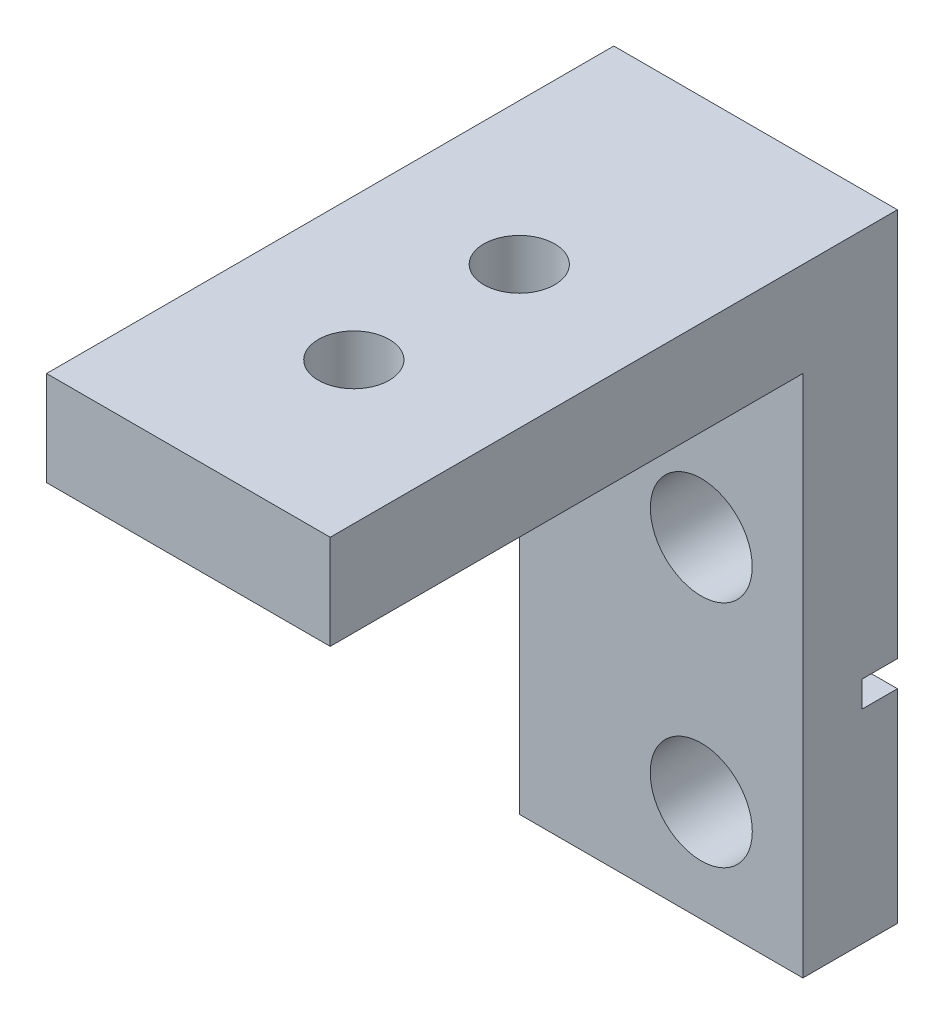
ISO-10303-21;
HEADER;
FILE_DESCRIPTION(('STEP AP214'),'2;1');
FILE_NAME('part.step','',(''),(''),'','','');
FILE_SCHEMA(('AUTOMOTIVE_DESIGN { 1 0 10303 214 1 1 1 1 }'));
ENDSEC;
DATA;
#1=APPLICATION_CONTEXT('core data for automotive mechanical design processes');
#2=APPLICATION_PROTOCOL_DEFINITION('international standard','automotive_design',2000,#1);
#3=PRODUCT_CONTEXT('',#1,'mechanical');
#4=PRODUCT('Part','Part','',(#3));
#5=PRODUCT_RELATED_PRODUCT_CATEGORY('part','',(#4));
#6=PRODUCT_DEFINITION_FORMATION('','',#4);
#7=PRODUCT_DEFINITION_CONTEXT('part definition',#1,'design');
#8=PRODUCT_DEFINITION('design','',#6,#7);
#9=PRODUCT_DEFINITION_SHAPE('','',#8);
#10=(LENGTH_UNIT() NAMED_UNIT(*) SI_UNIT(.MILLI.,.METRE.));
#11=(NAMED_UNIT(*) PLANE_ANGLE_UNIT() SI_UNIT($,.RADIAN.));
#12=(NAMED_UNIT(*) SI_UNIT($,.STERADIAN.) SOLID_ANGLE_UNIT());
#13=UNCERTAINTY_MEASURE_WITH_UNIT(LENGTH_MEASURE(1.E-05),#10,'distance_accuracy_value','');
#14=(GEOMETRIC_REPRESENTATION_CONTEXT(3) GLOBAL_UNCERTAINTY_ASSIGNED_CONTEXT((#13)) GLOBAL_UNIT_ASSIGNED_CONTEXT((#10,
#11,#12)) REPRESENTATION_CONTEXT('',''));
#15=CARTESIAN_POINT('',(0.,0.,0.));
#16=DIRECTION('',(0.,0.,1.));
#17=DIRECTION('',(1.,0.,0.));
#18=AXIS2_PLACEMENT_3D('',#15,#16,#17);
#19=CARTESIAN_POINT('',(-6.,-11.1,4.));
#20=DIRECTION('',(1.,0.,0.));
#21=DIRECTION('',(0.,0.,-1.));
#22=AXIS2_PLACEMENT_3D('',#19,#20,#21);
#23=PLANE('',#22);
#24=DIRECTION('',(0.,-1.,0.));
#25=VECTOR('',#24,1.);
#26=CARTESIAN_POINT('',(-6.,-11.1,4.));
#27=LINE('',#26,#25);
#28=CARTESIAN_POINT('',(-6.,11.05,4.));
#29=VERTEX_POINT('',#28);
#30=CARTESIAN_POINT('',(-6.,-11.1,4.));
#31=VERTEX_POINT('',#30);
#32=EDGE_CURVE('E144',#29,#31,#27,.T.);
#33=ORIENTED_EDGE('',*,*,#32,.F.);
#34=DIRECTION('',(0.,0.,-1.));
#35=VECTOR('',#34,1.);
#36=CARTESIAN_POINT('',(-6.,11.05,24.));
#37=LINE('',#36,#35);
#38=CARTESIAN_POINT('',(-6.,11.05,24.));
#39=VERTEX_POINT('',#38);
#40=EDGE_CURVE('E124',#39,#29,#37,.T.);
#41=ORIENTED_EDGE('',*,*,#40,.F.);
#42=DIRECTION('',(0.,-1.,0.));
#43=VECTOR('',#42,1.);
#44=CARTESIAN_POINT('',(-6.,15.05,24.));
#45=LINE('',#44,#43);
#46=CARTESIAN_POINT('',(-6.,15.05,24.));
#47=VERTEX_POINT('',#46);
#48=EDGE_CURVE('E132',#47,#39,#45,.T.);
#49=ORIENTED_EDGE('',*,*,#48,.F.);
#50=DIRECTION('',(0.,0.,1.));
#51=VECTOR('',#50,1.);
#52=CARTESIAN_POINT('',(-6.,15.05,0.));
#53=LINE('',#52,#51);
#54=CARTESIAN_POINT('',(-6.,15.05,0.));
#55=VERTEX_POINT('',#54);
#56=EDGE_CURVE('E156',#55,#47,#53,.T.);
#57=ORIENTED_EDGE('',*,*,#56,.F.);
#58=DIRECTION('',(0.,-1.,0.));
#59=VECTOR('',#58,1.);
#60=CARTESIAN_POINT('',(-6.,-11.1,0.));
#61=LINE('',#60,#59);
#62=CARTESIAN_POINT('',(-6.,-1.4,0.));
#63=VERTEX_POINT('',#62);
#64=EDGE_CURVE('E223',#55,#63,#61,.T.);
#65=ORIENTED_EDGE('',*,*,#64,.T.);
#66=DIRECTION('',(0.,0.,-1.));
#67=VECTOR('',#66,1.);
#68=CARTESIAN_POINT('',(-6.,-1.4,1.5));
#69=LINE('',#68,#67);
#70=CARTESIAN_POINT('',(-6.,-1.4,1.5));
#71=VERTEX_POINT('',#70);
#72=EDGE_CURVE('E184',#71,#63,#69,.T.);
#73=ORIENTED_EDGE('',*,*,#72,.F.);
#74=DIRECTION('',(0.,1.,0.));
#75=VECTOR('',#74,1.);
#76=CARTESIAN_POINT('',(-6.,0.,1.5));
#77=LINE('',#76,#75);
#78=CARTESIAN_POINT('',(-6.,-2.5,1.5));
#79=VERTEX_POINT('',#78);
#80=EDGE_CURVE('E174',#79,#71,#77,.T.);
#81=ORIENTED_EDGE('',*,*,#80,.F.);
#82=DIRECTION('',(0.,0.,-1.));
#83=VECTOR('',#82,1.);
#84=CARTESIAN_POINT('',(-6.,-2.5,1.5));
#85=LINE('',#84,#83);
#86=CARTESIAN_POINT('',(-6.,-2.5,0.));
#87=VERTEX_POINT('',#86);
#88=EDGE_CURVE('E189',#79,#87,#85,.T.);
#89=ORIENTED_EDGE('',*,*,#88,.T.);
#90=CARTESIAN_POINT('',(-6.,-11.1,0.));
#91=VERTEX_POINT('',#90);
#92=EDGE_CURVE('E202',#87,#91,#61,.T.);
#93=ORIENTED_EDGE('',*,*,#92,.T.);
#94=DIRECTION('',(0.,0.,-1.));
#95=VECTOR('',#94,1.);
#96=CARTESIAN_POINT('',(-6.,-11.1,4.));
#97=LINE('',#96,#95);
#98=EDGE_CURVE('E11',#31,#91,#97,.T.);
#99=ORIENTED_EDGE('',*,*,#98,.F.);
#100=EDGE_LOOP('',(#33,#41,#49,#57,#65,#73,#81,#89,#93,#99));
#101=FACE_BOUND('',#100,.T.);
#102=ADVANCED_FACE('F43',(#101),#23,.F.);
#103=CARTESIAN_POINT('',(6.,-11.1,4.));
#104=DIRECTION('',(-1.,0.,0.));
#105=DIRECTION('',(0.,0.,1.));
#106=AXIS2_PLACEMENT_3D('',#103,#104,#105);
#107=PLANE('',#106);
#108=DIRECTION('',(0.,1.,0.));
#109=VECTOR('',#108,1.);
#110=CARTESIAN_POINT('',(6.,-11.1,0.));
#111=LINE('',#110,#109);
#112=CARTESIAN_POINT('',(6.,-1.4,0.));
#113=VERTEX_POINT('',#112);
#114=CARTESIAN_POINT('',(6.,15.05,0.));
#115=VERTEX_POINT('',#114);
#116=EDGE_CURVE('E229',#113,#115,#111,.T.);
#117=ORIENTED_EDGE('',*,*,#116,.T.);
#118=DIRECTION('',(0.,0.,1.));
#119=VECTOR('',#118,1.);
#120=CARTESIAN_POINT('',(6.,15.05,0.));
#121=LINE('',#120,#119);
#122=CARTESIAN_POINT('',(6.,15.05,24.));
#123=VERTEX_POINT('',#122);
#124=EDGE_CURVE('E151',#115,#123,#121,.T.);
#125=ORIENTED_EDGE('',*,*,#124,.T.);
#126=DIRECTION('',(0.,1.,0.));
#127=VECTOR('',#126,1.);
#128=CARTESIAN_POINT('',(6.,15.05,24.));
#129=LINE('',#128,#127);
#130=CARTESIAN_POINT('',(6.,11.05,24.));
#131=VERTEX_POINT('',#130);
#132=EDGE_CURVE('E131',#131,#123,#129,.T.);
#133=ORIENTED_EDGE('',*,*,#132,.F.);
#134=DIRECTION('',(0.,0.,-1.));
#135=VECTOR('',#134,1.);
#136=CARTESIAN_POINT('',(6.,11.05,24.));
#137=LINE('',#136,#135);
#138=CARTESIAN_POINT('',(6.,11.05,4.));
#139=VERTEX_POINT('',#138);
#140=EDGE_CURVE('E126',#131,#139,#137,.T.);
#141=ORIENTED_EDGE('',*,*,#140,.T.);
#142=DIRECTION('',(0.,1.,0.));
#143=VECTOR('',#142,1.);
#144=CARTESIAN_POINT('',(6.,-11.1,4.));
#145=LINE('',#144,#143);
#146=CARTESIAN_POINT('',(6.,-11.1,4.));
#147=VERTEX_POINT('',#146);
#148=EDGE_CURVE('E220',#147,#139,#145,.T.);
#149=ORIENTED_EDGE('',*,*,#148,.F.);
#150=DIRECTION('',(0.,0.,-1.));
#151=VECTOR('',#150,1.);
#152=CARTESIAN_POINT('',(6.,-11.1,4.));
#153=LINE('',#152,#151);
#154=CARTESIAN_POINT('',(6.,-11.1,0.));
#155=VERTEX_POINT('',#154);
#156=EDGE_CURVE('E51',#147,#155,#153,.T.);
#157=ORIENTED_EDGE('',*,*,#156,.T.);
#158=CARTESIAN_POINT('',(6.,-2.5,0.));
#159=VERTEX_POINT('',#158);
#160=EDGE_CURVE('E217',#155,#159,#111,.T.);
#161=ORIENTED_EDGE('',*,*,#160,.T.);
#162=DIRECTION('',(0.,0.,-1.));
#163=VECTOR('',#162,1.);
#164=CARTESIAN_POINT('',(6.,-2.5,1.5));
#165=LINE('',#164,#163);
#166=CARTESIAN_POINT('',(6.,-2.5,1.5));
#167=VERTEX_POINT('',#166);
#168=EDGE_CURVE('E66',#167,#159,#165,.T.);
#169=ORIENTED_EDGE('',*,*,#168,.F.);
#170=DIRECTION('',(0.,-1.,0.));
#171=VECTOR('',#170,1.);
#172=CARTESIAN_POINT('',(6.,0.,1.5));
#173=LINE('',#172,#171);
#174=CARTESIAN_POINT('',(6.,-1.4,1.5));
#175=VERTEX_POINT('',#174);
#176=EDGE_CURVE('E165',#175,#167,#173,.T.);
#177=ORIENTED_EDGE('',*,*,#176,.F.);
#178=DIRECTION('',(0.,0.,-1.));
#179=VECTOR('',#178,1.);
#180=CARTESIAN_POINT('',(6.,-1.4,1.5));
#181=LINE('',#180,#179);
#182=EDGE_CURVE('E178',#175,#113,#181,.T.);
#183=ORIENTED_EDGE('',*,*,#182,.T.);
#184=EDGE_LOOP('',(#117,#125,#133,#141,#149,#157,#161,#169,#177,#183));
#185=FACE_BOUND('',#184,.T.);
#186=ADVANCED_FACE('F238',(#185),#107,.F.);
#187=CARTESIAN_POINT('',(0.,0.,0.));
#188=DIRECTION('',(0.,0.,1.));
#189=DIRECTION('',(1.,0.,0.));
#190=AXIS2_PLACEMENT_3D('',#187,#188,#189);
#191=PLANE('',#190);
#192=CARTESIAN_POINT('',(1.7,2.9,0.));
#193=DIRECTION('',(0.,0.,1.));
#194=DIRECTION('',(1.,0.,0.));
#195=AXIS2_PLACEMENT_3D('',#192,#193,#194);
#196=CIRCLE('',#195,2.155);
#197=CARTESIAN_POINT('',(3.855,2.9,0.));
#198=VERTEX_POINT('',#197);
#199=EDGE_CURVE('E188',#198,#198,#196,.T.);
#200=ORIENTED_EDGE('',*,*,#199,.T.);
#201=EDGE_LOOP('',(#200));
#202=FACE_BOUND('',#201,.T.);
#203=ORIENTED_EDGE('',*,*,#64,.F.);
#204=DIRECTION('',(-1.,0.,0.));
#205=VECTOR('',#204,1.);
#206=CARTESIAN_POINT('',(6.,15.05,0.));
#207=LINE('',#206,#205);
#208=EDGE_CURVE('E146',#115,#55,#207,.T.);
#209=ORIENTED_EDGE('',*,*,#208,.F.);
#210=ORIENTED_EDGE('',*,*,#116,.F.);
#211=DIRECTION('',(-1.,0.,0.));
#212=VECTOR('',#211,1.);
#213=CARTESIAN_POINT('',(0.,-1.4,0.));
#214=LINE('',#213,#212);
#215=EDGE_CURVE('E159',#113,#63,#214,.T.);
#216=ORIENTED_EDGE('',*,*,#215,.T.);
#217=EDGE_LOOP('',(#203,#209,#210,#216));
#218=FACE_BOUND('',#217,.T.);
#219=ADVANCED_FACE('F257',(#202,#218),#191,.F.);
#220=CARTESIAN_POINT('',(6.,-11.1,4.));
#221=DIRECTION('',(0.,1.,0.));
#222=DIRECTION('',(-1.,0.,0.));
#223=AXIS2_PLACEMENT_3D('',#220,#221,#222);
#224=PLANE('',#223);
#225=DIRECTION('',(1.,0.,0.));
#226=VECTOR('',#225,1.);
#227=CARTESIAN_POINT('',(6.,-11.1,0.));
#228=LINE('',#227,#226);
#229=EDGE_CURVE('E226',#91,#155,#228,.T.);
#230=ORIENTED_EDGE('',*,*,#229,.T.);
#231=ORIENTED_EDGE('',*,*,#156,.F.);
#232=DIRECTION('',(1.,0.,0.));
#233=VECTOR('',#232,1.);
#234=CARTESIAN_POINT('',(6.,-11.1,4.));
#235=LINE('',#234,#233);
#236=EDGE_CURVE('E216',#31,#147,#235,.T.);
#237=ORIENTED_EDGE('',*,*,#236,.F.);
#238=ORIENTED_EDGE('',*,*,#98,.T.);
#239=EDGE_LOOP('',(#230,#231,#237,#238));
#240=FACE_BOUND('',#239,.T.);
#241=ADVANCED_FACE('F313',(#240),#224,.F.);
#242=CARTESIAN_POINT('',(0.,0.,4.));
#243=DIRECTION('',(0.,0.,1.));
#244=DIRECTION('',(1.,0.,0.));
#245=AXIS2_PLACEMENT_3D('',#242,#243,#244);
#246=PLANE('',#245);
#247=DIRECTION('',(1.,0.,0.));
#248=VECTOR('',#247,1.);
#249=CARTESIAN_POINT('',(-6.,11.05,4.));
#250=LINE('',#249,#248);
#251=EDGE_CURVE('E58',#29,#139,#250,.T.);
#252=ORIENTED_EDGE('',*,*,#251,.F.);
#253=ORIENTED_EDGE('',*,*,#32,.T.);
#254=ORIENTED_EDGE('',*,*,#236,.T.);
#255=ORIENTED_EDGE('',*,*,#148,.T.);
#256=EDGE_LOOP('',(#252,#253,#254,#255));
#257=FACE_BOUND('',#256,.T.);
#258=CARTESIAN_POINT('',(1.7,-6.8,4.));
#259=DIRECTION('',(0.,0.,1.));
#260=DIRECTION('',(1.,0.,0.));
#261=AXIS2_PLACEMENT_3D('',#258,#259,#260);
#262=CIRCLE('',#261,2.16);
#263=CARTESIAN_POINT('',(3.86,-6.8,4.));
#264=VERTEX_POINT('',#263);
#265=EDGE_CURVE('E203',#264,#264,#262,.T.);
#266=ORIENTED_EDGE('',*,*,#265,.F.);
#267=EDGE_LOOP('',(#266));
#268=FACE_BOUND('',#267,.T.);
#269=CARTESIAN_POINT('',(1.7,2.9,4.));
#270=DIRECTION('',(0.,0.,1.));
#271=DIRECTION('',(1.,0.,0.));
#272=AXIS2_PLACEMENT_3D('',#269,#270,#271);
#273=CIRCLE('',#272,2.155);
#274=CARTESIAN_POINT('',(3.855,2.9,4.));
#275=VERTEX_POINT('',#274);
#276=EDGE_CURVE('E207',#275,#275,#273,.T.);
#277=ORIENTED_EDGE('',*,*,#276,.F.);
#278=EDGE_LOOP('',(#277));
#279=FACE_BOUND('',#278,.T.);
#280=ADVANCED_FACE('F318',(#257,#268,#279),#246,.T.);
#281=CARTESIAN_POINT('',(1.7,-6.8,0.));
#282=DIRECTION('',(0.,0.,1.));
#283=DIRECTION('',(1.,0.,0.));
#284=AXIS2_PLACEMENT_3D('',#281,#282,#283);
#285=CIRCLE('',#284,2.16);
#286=CARTESIAN_POINT('',(3.86,-6.8,0.));
#287=VERTEX_POINT('',#286);
#288=EDGE_CURVE('E198',#287,#287,#285,.T.);
#289=ORIENTED_EDGE('',*,*,#288,.T.);
#290=EDGE_LOOP('',(#289));
#291=FACE_BOUND('',#290,.T.);
#292=ORIENTED_EDGE('',*,*,#92,.F.);
#293=DIRECTION('',(-1.,0.,0.));
#294=VECTOR('',#293,1.);
#295=CARTESIAN_POINT('',(0.,-2.5,0.));
#296=LINE('',#295,#294);
#297=EDGE_CURVE('E166',#159,#87,#296,.T.);
#298=ORIENTED_EDGE('',*,*,#297,.F.);
#299=ORIENTED_EDGE('',*,*,#160,.F.);
#300=ORIENTED_EDGE('',*,*,#229,.F.);
#301=EDGE_LOOP('',(#292,#298,#299,#300));
#302=FACE_BOUND('',#301,.T.);
#303=ADVANCED_FACE('F244',(#291,#302),#191,.F.);
#304=CARTESIAN_POINT('',(1.7,2.9,0.));
#305=DIRECTION('',(0.,0.,1.));
#306=DIRECTION('',(1.,0.,0.));
#307=AXIS2_PLACEMENT_3D('',#304,#305,#306);
#308=CYLINDRICAL_SURFACE('',#307,2.155);
#309=ORIENTED_EDGE('',*,*,#199,.F.);
#310=EDGE_LOOP('',(#309));
#311=FACE_BOUND('',#310,.T.);
#312=ORIENTED_EDGE('',*,*,#276,.T.);
#313=EDGE_LOOP('',(#312));
#314=FACE_BOUND('',#313,.T.);
#315=ADVANCED_FACE('F327',(#311,#314),#308,.F.);
#316=CARTESIAN_POINT('',(1.7,-6.8,0.));
#317=DIRECTION('',(0.,0.,1.));
#318=DIRECTION('',(1.,0.,0.));
#319=AXIS2_PLACEMENT_3D('',#316,#317,#318);
#320=CYLINDRICAL_SURFACE('',#319,2.16);
#321=ORIENTED_EDGE('',*,*,#288,.F.);
#322=EDGE_LOOP('',(#321));
#323=FACE_BOUND('',#322,.T.);
#324=ORIENTED_EDGE('',*,*,#265,.T.);
#325=EDGE_LOOP('',(#324));
#326=FACE_BOUND('',#325,.T.);
#327=ADVANCED_FACE('F329',(#323,#326),#320,.F.);
#328=CARTESIAN_POINT('',(0.,-1.4,1.5));
#329=DIRECTION('',(0.,-1.,0.));
#330=DIRECTION('',(1.,0.,0.));
#331=AXIS2_PLACEMENT_3D('',#328,#329,#330);
#332=PLANE('',#331);
#333=ORIENTED_EDGE('',*,*,#215,.F.);
#334=ORIENTED_EDGE('',*,*,#182,.F.);
#335=DIRECTION('',(-1.,0.,0.));
#336=VECTOR('',#335,1.);
#337=CARTESIAN_POINT('',(0.,-1.4,1.5));
#338=LINE('',#337,#336);
#339=EDGE_CURVE('E162',#175,#71,#338,.T.);
#340=ORIENTED_EDGE('',*,*,#339,.T.);
#341=ORIENTED_EDGE('',*,*,#72,.T.);
#342=EDGE_LOOP('',(#333,#334,#340,#341));
#343=FACE_BOUND('',#342,.T.);
#344=ADVANCED_FACE('F336',(#343),#332,.T.);
#345=CARTESIAN_POINT('',(0.,-2.5,1.5));
#346=DIRECTION('',(0.,-1.,0.));
#347=DIRECTION('',(0.,0.,-1.));
#348=AXIS2_PLACEMENT_3D('',#345,#346,#347);
#349=PLANE('',#348);
#350=ORIENTED_EDGE('',*,*,#297,.T.);
#351=ORIENTED_EDGE('',*,*,#88,.F.);
#352=DIRECTION('',(-1.,0.,0.));
#353=VECTOR('',#352,1.);
#354=CARTESIAN_POINT('',(0.,-2.5,1.5));
#355=LINE('',#354,#353);
#356=EDGE_CURVE('E170',#167,#79,#355,.T.);
#357=ORIENTED_EDGE('',*,*,#356,.F.);
#358=ORIENTED_EDGE('',*,*,#168,.T.);
#359=EDGE_LOOP('',(#350,#351,#357,#358));
#360=FACE_BOUND('',#359,.T.);
#361=ADVANCED_FACE('F245',(#360),#349,.F.);
#362=CARTESIAN_POINT('',(0.,0.,1.5));
#363=DIRECTION('',(0.,0.,-1.));
#364=DIRECTION('',(-1.,0.,0.));
#365=AXIS2_PLACEMENT_3D('',#362,#363,#364);
#366=PLANE('',#365);
#367=ORIENTED_EDGE('',*,*,#339,.F.);
#368=ORIENTED_EDGE('',*,*,#176,.T.);
#369=ORIENTED_EDGE('',*,*,#356,.T.);
#370=ORIENTED_EDGE('',*,*,#80,.T.);
#371=EDGE_LOOP('',(#367,#368,#369,#370));
#372=FACE_BOUND('',#371,.T.);
#373=ADVANCED_FACE('F250',(#372),#366,.T.);
#374=CARTESIAN_POINT('',(6.,15.05,0.));
#375=DIRECTION('',(0.,1.,0.));
#376=DIRECTION('',(-1.,0.,0.));
#377=AXIS2_PLACEMENT_3D('',#374,#375,#376);
#378=PLANE('',#377);
#379=CARTESIAN_POINT('',(0.,15.05,10.));
#380=DIRECTION('',(0.,-1.,0.));
#381=DIRECTION('',(0.,0.,-1.));
#382=AXIS2_PLACEMENT_3D('',#379,#380,#381);
#383=CIRCLE('',#382,1.5);
#384=CARTESIAN_POINT('',(0.,15.05,8.5));
#385=VERTEX_POINT('',#384);
#386=EDGE_CURVE('E267',#385,#385,#383,.T.);
#387=ORIENTED_EDGE('',*,*,#386,.T.);
#388=EDGE_LOOP('',(#387));
#389=FACE_BOUND('',#388,.T.);
#390=CARTESIAN_POINT('',(0.,15.05,17.));
#391=DIRECTION('',(0.,-1.,0.));
#392=DIRECTION('',(0.,0.,-1.));
#393=AXIS2_PLACEMENT_3D('',#390,#391,#392);
#394=CIRCLE('',#393,1.5);
#395=CARTESIAN_POINT('',(0.,15.05,15.5));
#396=VERTEX_POINT('',#395);
#397=EDGE_CURVE('E282',#396,#396,#394,.T.);
#398=ORIENTED_EDGE('',*,*,#397,.T.);
#399=EDGE_LOOP('',(#398));
#400=FACE_BOUND('',#399,.T.);
#401=ORIENTED_EDGE('',*,*,#56,.T.);
#402=DIRECTION('',(-1.,0.,0.));
#403=VECTOR('',#402,1.);
#404=CARTESIAN_POINT('',(-6.,15.05,24.));
#405=LINE('',#404,#403);
#406=EDGE_CURVE('E138',#123,#47,#405,.T.);
#407=ORIENTED_EDGE('',*,*,#406,.F.);
#408=ORIENTED_EDGE('',*,*,#124,.F.);
#409=ORIENTED_EDGE('',*,*,#208,.T.);
#410=EDGE_LOOP('',(#401,#407,#408,#409));
#411=FACE_BOUND('',#410,.T.);
#412=ADVANCED_FACE('F261',(#389,#400,#411),#378,.T.);
#413=CARTESIAN_POINT('',(-6.,11.05,24.));
#414=DIRECTION('',(0.,1.,0.));
#415=DIRECTION('',(0.,0.,1.));
#416=AXIS2_PLACEMENT_3D('',#413,#414,#415);
#417=PLANE('',#416);
#418=CARTESIAN_POINT('',(0.,11.05,10.));
#419=DIRECTION('',(0.,-1.,0.));
#420=DIRECTION('',(0.,0.,-1.));
#421=AXIS2_PLACEMENT_3D('',#418,#419,#420);
#422=CIRCLE('',#421,1.5);
#423=CARTESIAN_POINT('',(0.,11.05,8.5));
#424=VERTEX_POINT('',#423);
#425=EDGE_CURVE('E270',#424,#424,#422,.T.);
#426=ORIENTED_EDGE('',*,*,#425,.F.);
#427=EDGE_LOOP('',(#426));
#428=FACE_BOUND('',#427,.T.);
#429=CARTESIAN_POINT('',(0.,11.05,17.));
#430=DIRECTION('',(0.,-1.,0.));
#431=DIRECTION('',(0.,0.,-1.));
#432=AXIS2_PLACEMENT_3D('',#429,#430,#431);
#433=CIRCLE('',#432,1.5);
#434=CARTESIAN_POINT('',(0.,11.05,15.5));
#435=VERTEX_POINT('',#434);
#436=EDGE_CURVE('E276',#435,#435,#433,.T.);
#437=ORIENTED_EDGE('',*,*,#436,.F.);
#438=EDGE_LOOP('',(#437));
#439=FACE_BOUND('',#438,.T.);
#440=ORIENTED_EDGE('',*,*,#251,.T.);
#441=ORIENTED_EDGE('',*,*,#140,.F.);
#442=DIRECTION('',(1.,0.,0.));
#443=VECTOR('',#442,1.);
#444=CARTESIAN_POINT('',(-6.,11.05,24.));
#445=LINE('',#444,#443);
#446=EDGE_CURVE('E120',#39,#131,#445,.T.);
#447=ORIENTED_EDGE('',*,*,#446,.F.);
#448=ORIENTED_EDGE('',*,*,#40,.T.);
#449=EDGE_LOOP('',(#440,#441,#447,#448));
#450=FACE_BOUND('',#449,.T.);
#451=ADVANCED_FACE('F122',(#428,#439,#450),#417,.F.);
#452=CARTESIAN_POINT('',(0.,0.,24.));
#453=DIRECTION('',(0.,0.,1.));
#454=DIRECTION('',(1.,0.,0.));
#455=AXIS2_PLACEMENT_3D('',#452,#453,#454);
#456=PLANE('',#455);
#457=ORIENTED_EDGE('',*,*,#48,.T.);
#458=ORIENTED_EDGE('',*,*,#446,.T.);
#459=ORIENTED_EDGE('',*,*,#132,.T.);
#460=ORIENTED_EDGE('',*,*,#406,.T.);
#461=EDGE_LOOP('',(#457,#458,#459,#460));
#462=FACE_BOUND('',#461,.T.);
#463=ADVANCED_FACE('F136',(#462),#456,.T.);
#464=CARTESIAN_POINT('',(0.,15.05,17.));
#465=DIRECTION('',(0.,-1.,0.));
#466=DIRECTION('',(0.,0.,-1.));
#467=AXIS2_PLACEMENT_3D('',#464,#465,#466);
#468=CYLINDRICAL_SURFACE('',#467,1.5);
#469=ORIENTED_EDGE('',*,*,#397,.F.);
#470=EDGE_LOOP('',(#469));
#471=FACE_BOUND('',#470,.T.);
#472=ORIENTED_EDGE('',*,*,#436,.T.);
#473=EDGE_LOOP('',(#472));
#474=FACE_BOUND('',#473,.T.);
#475=ADVANCED_FACE('F288',(#471,#474),#468,.F.);
#476=CARTESIAN_POINT('',(0.,15.05,10.));
#477=DIRECTION('',(0.,-1.,0.));
#478=DIRECTION('',(0.,0.,-1.));
#479=AXIS2_PLACEMENT_3D('',#476,#477,#478);
#480=CYLINDRICAL_SURFACE('',#479,1.5);
#481=ORIENTED_EDGE('',*,*,#386,.F.);
#482=EDGE_LOOP('',(#481));
#483=FACE_BOUND('',#482,.T.);
#484=ORIENTED_EDGE('',*,*,#425,.T.);
#485=EDGE_LOOP('',(#484));
#486=FACE_BOUND('',#485,.T.);
#487=ADVANCED_FACE('F291',(#483,#486),#480,.F.);
#488=CLOSED_SHELL('',(#102,#186,#219,#241,#280,#303,#315,#327,#344,#361,#373,#412,#451,#463,
#475,#487));
#489=MANIFOLD_SOLID_BREP('B2',#488);
#490=ADVANCED_BREP_SHAPE_REPRESENTATION('',(#18,#489),#14);
#491=SHAPE_DEFINITION_REPRESENTATION(#9,#490);
ENDSEC;
END-ISO-10303-21;
